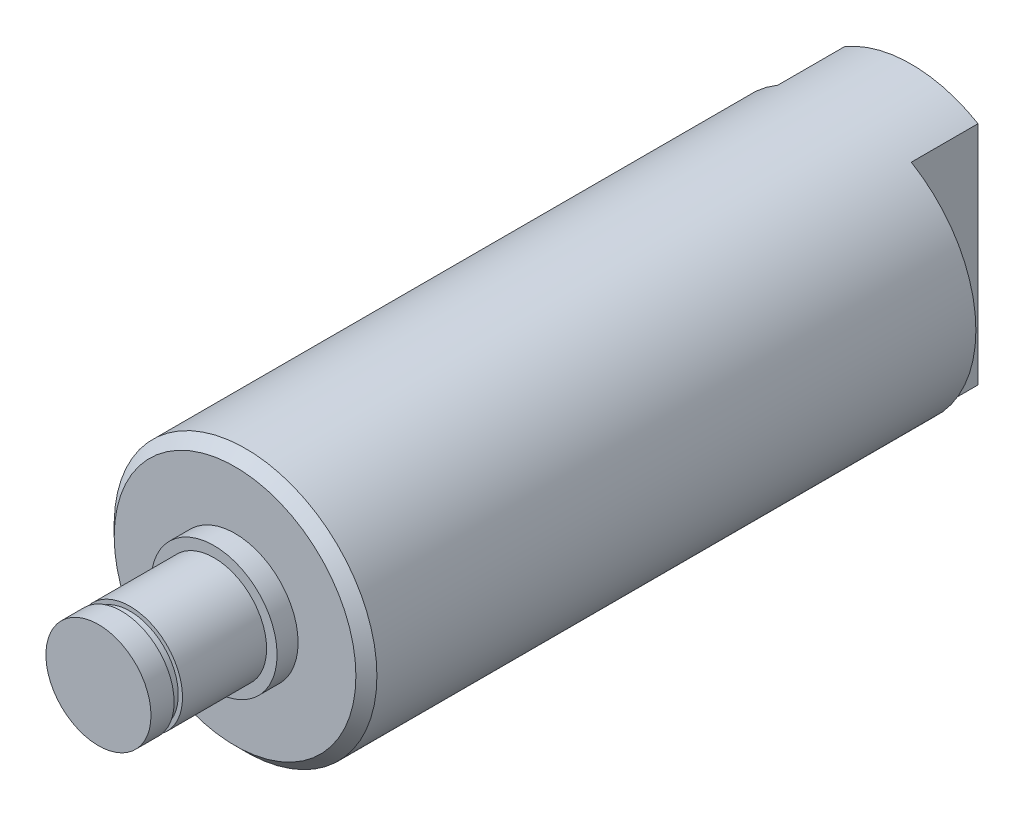
ISO-10303-21;
HEADER;
FILE_DESCRIPTION(('STEP AP214'),'2;1');
FILE_NAME('part.step','',(''),(''),'','','');
FILE_SCHEMA(('AUTOMOTIVE_DESIGN { 1 0 10303 214 1 1 1 1 }'));
ENDSEC;
DATA;
#1=APPLICATION_CONTEXT('core data for automotive mechanical design processes');
#2=APPLICATION_PROTOCOL_DEFINITION('international standard','automotive_design',2000,#1);
#3=PRODUCT_CONTEXT('',#1,'mechanical');
#4=PRODUCT('Part','Part','',(#3));
#5=PRODUCT_RELATED_PRODUCT_CATEGORY('part','',(#4));
#6=PRODUCT_DEFINITION_FORMATION('','',#4);
#7=PRODUCT_DEFINITION_CONTEXT('part definition',#1,'design');
#8=PRODUCT_DEFINITION('design','',#6,#7);
#9=PRODUCT_DEFINITION_SHAPE('','',#8);
#10=(LENGTH_UNIT() NAMED_UNIT(*) SI_UNIT(.MILLI.,.METRE.));
#11=(NAMED_UNIT(*) PLANE_ANGLE_UNIT() SI_UNIT($,.RADIAN.));
#12=(NAMED_UNIT(*) SI_UNIT($,.STERADIAN.) SOLID_ANGLE_UNIT());
#13=UNCERTAINTY_MEASURE_WITH_UNIT(LENGTH_MEASURE(1.E-05),#10,'distance_accuracy_value','');
#14=(GEOMETRIC_REPRESENTATION_CONTEXT(3) GLOBAL_UNCERTAINTY_ASSIGNED_CONTEXT((#13)) GLOBAL_UNIT_ASSIGNED_CONTEXT((#10,
#11,#12)) REPRESENTATION_CONTEXT('',''));
#15=CARTESIAN_POINT('',(0.,0.,0.));
#16=DIRECTION('',(0.,0.,1.));
#17=DIRECTION('',(1.,0.,0.));
#18=AXIS2_PLACEMENT_3D('',#15,#16,#17);
#19=CARTESIAN_POINT('',(0.,0.,77.35));
#20=DIRECTION('',(0.,0.,-1.));
#21=DIRECTION('',(-1.,0.,0.));
#22=AXIS2_PLACEMENT_3D('',#19,#20,#21);
#23=CYLINDRICAL_SURFACE('',#22,5.);
#24=CARTESIAN_POINT('',(0.,0.,74.35));
#25=DIRECTION('',(0.,0.,-1.));
#26=DIRECTION('',(-1.,0.,0.));
#27=AXIS2_PLACEMENT_3D('',#24,#25,#26);
#28=CIRCLE('',#27,5.);
#29=CARTESIAN_POINT('',(-5.,0.,74.35));
#30=VERTEX_POINT('',#29);
#31=EDGE_CURVE('E117',#30,#30,#28,.T.);
#32=ORIENTED_EDGE('',*,*,#31,.T.);
#33=EDGE_LOOP('',(#32));
#34=FACE_BOUND('',#33,.T.);
#35=CARTESIAN_POINT('',(0.,0.,66.35));
#36=DIRECTION('',(0.,0.,1.));
#37=DIRECTION('',(1.,0.,0.));
#38=AXIS2_PLACEMENT_3D('',#35,#36,#37);
#39=CIRCLE('',#38,5.);
#40=CARTESIAN_POINT('',(5.,0.,66.35));
#41=VERTEX_POINT('',#40);
#42=EDGE_CURVE('E126',#41,#41,#39,.T.);
#43=ORIENTED_EDGE('',*,*,#42,.T.);
#44=EDGE_LOOP('',(#43));
#45=FACE_BOUND('',#44,.T.);
#46=ADVANCED_FACE('F38',(#34,#45),#23,.T.);
#47=CARTESIAN_POINT('',(0.,0.,6.35));
#48=DIRECTION('',(0.,0.,1.));
#49=DIRECTION('',(1.,0.,0.));
#50=AXIS2_PLACEMENT_3D('',#47,#48,#49);
#51=PLANE('',#50);
#52=DIRECTION('',(0.,-1.,0.));
#53=VECTOR('',#52,1.);
#54=CARTESIAN_POINT('',(6.35,10.7669633602051,6.35));
#55=LINE('',#54,#53);
#56=CARTESIAN_POINT('',(6.35,10.7669633602051,6.35));
#57=VERTEX_POINT('',#56);
#58=CARTESIAN_POINT('',(6.35,-10.7669633602051,6.35));
#59=VERTEX_POINT('',#58);
#60=EDGE_CURVE('E54',#57,#59,#55,.T.);
#61=ORIENTED_EDGE('',*,*,#60,.F.);
#62=CARTESIAN_POINT('',(0.,0.,6.35));
#63=DIRECTION('',(0.,0.,1.));
#64=DIRECTION('',(1.,0.,0.));
#65=AXIS2_PLACEMENT_3D('',#62,#63,#64);
#66=CIRCLE('',#65,12.5);
#67=EDGE_CURVE('E136',#59,#57,#66,.T.);
#68=ORIENTED_EDGE('',*,*,#67,.F.);
#69=EDGE_LOOP('',(#61,#68));
#70=FACE_BOUND('',#69,.T.);
#71=ADVANCED_FACE('F159',(#70),#51,.F.);
#72=DIRECTION('',(0.,1.,0.));
#73=VECTOR('',#72,1.);
#74=CARTESIAN_POINT('',(-6.34999999999999,10.7669633602051,6.35));
#75=LINE('',#74,#73);
#76=CARTESIAN_POINT('',(-6.34999999999999,-10.7669633602051,6.35));
#77=VERTEX_POINT('',#76);
#78=CARTESIAN_POINT('',(-6.34999999999999,10.7669633602051,6.35));
#79=VERTEX_POINT('',#78);
#80=EDGE_CURVE('E79',#77,#79,#75,.T.);
#81=ORIENTED_EDGE('',*,*,#80,.F.);
#82=EDGE_CURVE('E141',#79,#77,#66,.T.);
#83=ORIENTED_EDGE('',*,*,#82,.F.);
#84=EDGE_LOOP('',(#81,#83));
#85=FACE_BOUND('',#84,.T.);
#86=ADVANCED_FACE('F156',(#85),#51,.F.);
#87=CARTESIAN_POINT('',(0.,0.,66.35));
#88=DIRECTION('',(0.,0.,1.));
#89=DIRECTION('',(1.,0.,0.));
#90=AXIS2_PLACEMENT_3D('',#87,#88,#89);
#91=PLANE('',#90);
#92=CARTESIAN_POINT('',(0.,0.,66.35));
#93=DIRECTION('',(0.,0.,1.));
#94=DIRECTION('',(1.,0.,0.));
#95=AXIS2_PLACEMENT_3D('',#92,#93,#94);
#96=CIRCLE('',#95,6.);
#97=CARTESIAN_POINT('',(6.,0.,66.35));
#98=VERTEX_POINT('',#97);
#99=EDGE_CURVE('E133',#98,#98,#96,.T.);
#100=ORIENTED_EDGE('',*,*,#99,.T.);
#101=EDGE_LOOP('',(#100));
#102=FACE_BOUND('',#101,.T.);
#103=ORIENTED_EDGE('',*,*,#42,.F.);
#104=EDGE_LOOP('',(#103));
#105=FACE_BOUND('',#104,.T.);
#106=ADVANCED_FACE('F158',(#102,#105),#91,.T.);
#107=CARTESIAN_POINT('',(0.,0.,64.35));
#108=DIRECTION('',(0.,0.,1.));
#109=DIRECTION('',(1.,0.,0.));
#110=AXIS2_PLACEMENT_3D('',#107,#108,#109);
#111=PLANE('',#110);
#112=CARTESIAN_POINT('',(0.,0.,64.35));
#113=DIRECTION('',(0.,0.,1.));
#114=DIRECTION('',(1.,0.,0.));
#115=AXIS2_PLACEMENT_3D('',#112,#113,#114);
#116=CIRCLE('',#115,11.5);
#117=CARTESIAN_POINT('',(11.5,0.,64.35));
#118=VERTEX_POINT('',#117);
#119=EDGE_CURVE('E47',#118,#118,#116,.T.);
#120=ORIENTED_EDGE('',*,*,#119,.T.);
#121=EDGE_LOOP('',(#120));
#122=FACE_BOUND('',#121,.T.);
#123=CARTESIAN_POINT('',(0.,0.,64.35));
#124=DIRECTION('',(0.,0.,1.));
#125=DIRECTION('',(1.,0.,0.));
#126=AXIS2_PLACEMENT_3D('',#123,#124,#125);
#127=CIRCLE('',#126,6.);
#128=CARTESIAN_POINT('',(6.,0.,64.35));
#129=VERTEX_POINT('',#128);
#130=EDGE_CURVE('E130',#129,#129,#127,.T.);
#131=ORIENTED_EDGE('',*,*,#130,.F.);
#132=EDGE_LOOP('',(#131));
#133=FACE_BOUND('',#132,.T.);
#134=ADVANCED_FACE('F165',(#122,#133),#111,.T.);
#135=CARTESIAN_POINT('',(0.,0.,64.35));
#136=DIRECTION('',(0.,0.,-1.));
#137=DIRECTION('',(-1.,0.,0.));
#138=AXIS2_PLACEMENT_3D('',#135,#136,#137);
#139=CYLINDRICAL_SURFACE('',#138,12.5);
#140=CARTESIAN_POINT('',(0.,0.,63.35));
#141=DIRECTION('',(0.,0.,1.));
#142=DIRECTION('',(1.,0.,0.));
#143=AXIS2_PLACEMENT_3D('',#140,#141,#142);
#144=CIRCLE('',#143,12.5);
#145=CARTESIAN_POINT('',(12.5,0.,63.35));
#146=VERTEX_POINT('',#145);
#147=EDGE_CURVE('E11',#146,#146,#144,.F.);
#148=ORIENTED_EDGE('',*,*,#147,.T.);
#149=EDGE_LOOP('',(#148));
#150=FACE_BOUND('',#149,.T.);
#151=ORIENTED_EDGE('',*,*,#67,.T.);
#152=DIRECTION('',(0.,0.,1.));
#153=VECTOR('',#152,1.);
#154=CARTESIAN_POINT('',(6.35,10.7669633602051,0.));
#155=LINE('',#154,#153);
#156=CARTESIAN_POINT('',(6.35,10.7669633602051,0.));
#157=VERTEX_POINT('',#156);
#158=EDGE_CURVE('E124',#157,#57,#155,.T.);
#159=ORIENTED_EDGE('',*,*,#158,.F.);
#160=CARTESIAN_POINT('',(0.,0.,0.));
#161=DIRECTION('',(0.,0.,-1.));
#162=DIRECTION('',(-1.,0.,0.));
#163=AXIS2_PLACEMENT_3D('',#160,#161,#162);
#164=CIRCLE('',#163,12.5);
#165=CARTESIAN_POINT('',(-6.34999999999999,10.7669633602051,0.));
#166=VERTEX_POINT('',#165);
#167=EDGE_CURVE('E109',#166,#157,#164,.T.);
#168=ORIENTED_EDGE('',*,*,#167,.F.);
#169=DIRECTION('',(0.,0.,1.));
#170=VECTOR('',#169,1.);
#171=CARTESIAN_POINT('',(-6.34999999999999,10.7669633602051,0.));
#172=LINE('',#171,#170);
#173=EDGE_CURVE('E115',#166,#79,#172,.T.);
#174=ORIENTED_EDGE('',*,*,#173,.T.);
#175=ORIENTED_EDGE('',*,*,#82,.T.);
#176=DIRECTION('',(0.,0.,1.));
#177=VECTOR('',#176,1.);
#178=CARTESIAN_POINT('',(-6.34999999999999,-10.7669633602051,0.));
#179=LINE('',#178,#177);
#180=CARTESIAN_POINT('',(-6.34999999999999,-10.7669633602051,0.));
#181=VERTEX_POINT('',#180);
#182=EDGE_CURVE('E120',#181,#77,#179,.T.);
#183=ORIENTED_EDGE('',*,*,#182,.F.);
#184=CARTESIAN_POINT('',(0.,0.,0.));
#185=DIRECTION('',(0.,0.,-1.));
#186=DIRECTION('',(-1.,0.,0.));
#187=AXIS2_PLACEMENT_3D('',#184,#185,#186);
#188=CIRCLE('',#187,12.5);
#189=CARTESIAN_POINT('',(6.35,-10.7669633602051,0.));
#190=VERTEX_POINT('',#189);
#191=EDGE_CURVE('E112',#190,#181,#188,.T.);
#192=ORIENTED_EDGE('',*,*,#191,.F.);
#193=DIRECTION('',(0.,0.,1.));
#194=VECTOR('',#193,1.);
#195=CARTESIAN_POINT('',(6.35,-10.7669633602051,0.));
#196=LINE('',#195,#194);
#197=EDGE_CURVE('E122',#190,#59,#196,.T.);
#198=ORIENTED_EDGE('',*,*,#197,.T.);
#199=EDGE_LOOP('',(#151,#159,#168,#174,#175,#183,#192,#198));
#200=FACE_BOUND('',#199,.T.);
#201=ADVANCED_FACE('F152',(#150,#200),#139,.T.);
#202=CARTESIAN_POINT('',(0.,0.,66.35));
#203=DIRECTION('',(0.,0.,-1.));
#204=DIRECTION('',(-1.,0.,0.));
#205=AXIS2_PLACEMENT_3D('',#202,#203,#204);
#206=CYLINDRICAL_SURFACE('',#205,6.);
#207=ORIENTED_EDGE('',*,*,#99,.F.);
#208=EDGE_LOOP('',(#207));
#209=FACE_BOUND('',#208,.T.);
#210=ORIENTED_EDGE('',*,*,#130,.T.);
#211=EDGE_LOOP('',(#210));
#212=FACE_BOUND('',#211,.T.);
#213=ADVANCED_FACE('F214',(#209,#212),#206,.T.);
#214=CARTESIAN_POINT('',(6.35,10.7669633602051,0.));
#215=DIRECTION('',(-1.,0.,0.));
#216=DIRECTION('',(0.,0.,1.));
#217=AXIS2_PLACEMENT_3D('',#214,#215,#216);
#218=PLANE('',#217);
#219=ORIENTED_EDGE('',*,*,#60,.T.);
#220=ORIENTED_EDGE('',*,*,#197,.F.);
#221=DIRECTION('',(0.,-1.,0.));
#222=VECTOR('',#221,1.);
#223=CARTESIAN_POINT('',(6.35,10.7669633602051,0.));
#224=LINE('',#223,#222);
#225=EDGE_CURVE('E84',#157,#190,#224,.T.);
#226=ORIENTED_EDGE('',*,*,#225,.F.);
#227=ORIENTED_EDGE('',*,*,#158,.T.);
#228=EDGE_LOOP('',(#219,#220,#226,#227));
#229=FACE_BOUND('',#228,.T.);
#230=ADVANCED_FACE('F212',(#229),#218,.F.);
#231=CARTESIAN_POINT('',(-6.34999999999999,10.7669633602051,0.));
#232=DIRECTION('',(1.,0.,0.));
#233=DIRECTION('',(0.,1.,0.));
#234=AXIS2_PLACEMENT_3D('',#231,#232,#233);
#235=PLANE('',#234);
#236=ORIENTED_EDGE('',*,*,#80,.T.);
#237=ORIENTED_EDGE('',*,*,#173,.F.);
#238=DIRECTION('',(0.,1.,0.));
#239=VECTOR('',#238,1.);
#240=CARTESIAN_POINT('',(-6.34999999999999,10.7669633602051,0.));
#241=LINE('',#240,#239);
#242=EDGE_CURVE('E63',#181,#166,#241,.T.);
#243=ORIENTED_EDGE('',*,*,#242,.F.);
#244=ORIENTED_EDGE('',*,*,#182,.T.);
#245=EDGE_LOOP('',(#236,#237,#243,#244));
#246=FACE_BOUND('',#245,.T.);
#247=ADVANCED_FACE('F209',(#246),#235,.F.);
#248=CARTESIAN_POINT('',(0.,0.,0.));
#249=DIRECTION('',(0.,0.,1.));
#250=DIRECTION('',(1.,0.,0.));
#251=AXIS2_PLACEMENT_3D('',#248,#249,#250);
#252=PLANE('',#251);
#253=CARTESIAN_POINT('',(0.,0.,0.));
#254=DIRECTION('',(0.,0.,-1.));
#255=DIRECTION('',(-1.,0.,0.));
#256=AXIS2_PLACEMENT_3D('',#253,#254,#255);
#257=CIRCLE('',#256,4.4);
#258=CARTESIAN_POINT('',(-4.4,0.,0.));
#259=VERTEX_POINT('',#258);
#260=EDGE_CURVE('E98',#259,#259,#257,.T.);
#261=ORIENTED_EDGE('',*,*,#260,.F.);
#262=EDGE_LOOP('',(#261));
#263=FACE_BOUND('',#262,.T.);
#264=ORIENTED_EDGE('',*,*,#191,.T.);
#265=ORIENTED_EDGE('',*,*,#242,.T.);
#266=ORIENTED_EDGE('',*,*,#167,.T.);
#267=ORIENTED_EDGE('',*,*,#225,.T.);
#268=EDGE_LOOP('',(#264,#265,#266,#267));
#269=FACE_BOUND('',#268,.T.);
#270=ADVANCED_FACE('F204',(#263,#269),#252,.F.);
#271=CARTESIAN_POINT('',(0.,5.4,74.35));
#272=DIRECTION('',(0.,0.,-1.));
#273=DIRECTION('',(-1.,0.,0.));
#274=AXIS2_PLACEMENT_3D('',#271,#272,#273);
#275=PLANE('',#274);
#276=CARTESIAN_POINT('',(0.,0.,74.35));
#277=DIRECTION('',(0.,0.,-1.));
#278=DIRECTION('',(-1.,0.,0.));
#279=AXIS2_PLACEMENT_3D('',#276,#277,#278);
#280=CIRCLE('',#279,4.6);
#281=CARTESIAN_POINT('',(-4.6,0.,74.35));
#282=VERTEX_POINT('',#281);
#283=EDGE_CURVE('E97',#282,#282,#280,.T.);
#284=ORIENTED_EDGE('',*,*,#283,.T.);
#285=EDGE_LOOP('',(#284));
#286=FACE_BOUND('',#285,.T.);
#287=ORIENTED_EDGE('',*,*,#31,.F.);
#288=EDGE_LOOP('',(#287));
#289=FACE_BOUND('',#288,.T.);
#290=ADVANCED_FACE('F195',(#286,#289),#275,.F.);
#291=CARTESIAN_POINT('',(0.,5.4,75.15));
#292=DIRECTION('',(0.,0.,1.));
#293=DIRECTION('',(1.,0.,0.));
#294=AXIS2_PLACEMENT_3D('',#291,#292,#293);
#295=PLANE('',#294);
#296=CARTESIAN_POINT('',(0.,0.,75.15));
#297=DIRECTION('',(0.,0.,-1.));
#298=DIRECTION('',(-1.,0.,0.));
#299=AXIS2_PLACEMENT_3D('',#296,#297,#298);
#300=CIRCLE('',#299,4.6);
#301=CARTESIAN_POINT('',(-4.6,0.,75.15));
#302=VERTEX_POINT('',#301);
#303=EDGE_CURVE('E101',#302,#302,#300,.T.);
#304=ORIENTED_EDGE('',*,*,#303,.F.);
#305=EDGE_LOOP('',(#304));
#306=FACE_BOUND('',#305,.T.);
#307=CARTESIAN_POINT('',(0.,0.,75.15));
#308=DIRECTION('',(0.,0.,1.));
#309=DIRECTION('',(1.,0.,0.));
#310=AXIS2_PLACEMENT_3D('',#307,#308,#309);
#311=CIRCLE('',#310,5.);
#312=CARTESIAN_POINT('',(5.,0.,75.15));
#313=VERTEX_POINT('',#312);
#314=EDGE_CURVE('E108',#313,#313,#311,.T.);
#315=ORIENTED_EDGE('',*,*,#314,.F.);
#316=EDGE_LOOP('',(#315));
#317=FACE_BOUND('',#316,.T.);
#318=ADVANCED_FACE('F193',(#306,#317),#295,.F.);
#319=CARTESIAN_POINT('',(0.,0.,66.35));
#320=DIRECTION('',(0.,0.,-1.));
#321=DIRECTION('',(-1.,0.,0.));
#322=AXIS2_PLACEMENT_3D('',#319,#320,#321);
#323=CYLINDRICAL_SURFACE('',#322,4.6);
#324=ORIENTED_EDGE('',*,*,#283,.F.);
#325=EDGE_LOOP('',(#324));
#326=FACE_BOUND('',#325,.T.);
#327=ORIENTED_EDGE('',*,*,#303,.T.);
#328=EDGE_LOOP('',(#327));
#329=FACE_BOUND('',#328,.T.);
#330=ADVANCED_FACE('F187',(#326,#329),#323,.T.);
#331=CARTESIAN_POINT('',(0.,0.,77.35));
#332=DIRECTION('',(0.,0.,1.));
#333=DIRECTION('',(1.,0.,0.));
#334=AXIS2_PLACEMENT_3D('',#331,#332,#333);
#335=PLANE('',#334);
#336=CARTESIAN_POINT('',(0.,0.,77.35));
#337=DIRECTION('',(0.,0.,1.));
#338=DIRECTION('',(1.,0.,0.));
#339=AXIS2_PLACEMENT_3D('',#336,#337,#338);
#340=CIRCLE('',#339,5.);
#341=CARTESIAN_POINT('',(5.,0.,77.35));
#342=VERTEX_POINT('',#341);
#343=EDGE_CURVE('E127',#342,#342,#340,.T.);
#344=ORIENTED_EDGE('',*,*,#343,.T.);
#345=EDGE_LOOP('',(#344));
#346=FACE_BOUND('',#345,.T.);
#347=ADVANCED_FACE('F180',(#346),#335,.T.);
#348=ORIENTED_EDGE('',*,*,#314,.T.);
#349=EDGE_LOOP('',(#348));
#350=FACE_BOUND('',#349,.T.);
#351=ORIENTED_EDGE('',*,*,#343,.F.);
#352=EDGE_LOOP('',(#351));
#353=FACE_BOUND('',#352,.T.);
#354=ADVANCED_FACE('F174',(#350,#353),#23,.T.);
#355=CARTESIAN_POINT('',(0.,0.,64.35));
#356=DIRECTION('',(0.,0.,-1.));
#357=DIRECTION('',(-1.,0.,0.));
#358=AXIS2_PLACEMENT_3D('',#355,#356,#357);
#359=CONICAL_SURFACE('',#358,11.5,0.785398163397445);
#360=ORIENTED_EDGE('',*,*,#147,.F.);
#361=EDGE_LOOP('',(#360));
#362=FACE_BOUND('',#361,.T.);
#363=ORIENTED_EDGE('',*,*,#119,.F.);
#364=EDGE_LOOP('',(#363));
#365=FACE_BOUND('',#364,.T.);
#366=ADVANCED_FACE('F41',(#362,#365),#359,.T.);
#367=CARTESIAN_POINT('',(0.,0.,25.));
#368=DIRECTION('',(0.,0.,-1.));
#369=DIRECTION('',(-1.,0.,0.));
#370=AXIS2_PLACEMENT_3D('',#367,#368,#369);
#371=CONICAL_SURFACE('',#370,4.39999999999999,1.02974425867665);
#372=CARTESIAN_POINT('',(0.,0.,27.6437867237213));
#373=VERTEX_POINT('',#372);
#374=VERTEX_LOOP('',#373);
#375=FACE_BOUND('',#374,.T.);
#376=CARTESIAN_POINT('',(0.,0.,25.));
#377=DIRECTION('',(0.,0.,-1.));
#378=DIRECTION('',(-1.,0.,0.));
#379=AXIS2_PLACEMENT_3D('',#376,#377,#378);
#380=CIRCLE('',#379,4.39999999999999);
#381=CARTESIAN_POINT('',(-4.39999999999999,0.,25.));
#382=VERTEX_POINT('',#381);
#383=EDGE_CURVE('E95',#382,#382,#380,.T.);
#384=ORIENTED_EDGE('',*,*,#383,.T.);
#385=EDGE_LOOP('',(#384));
#386=FACE_BOUND('',#385,.T.);
#387=ADVANCED_FACE('F88',(#375,#386),#371,.F.);
#388=CARTESIAN_POINT('',(0.,0.,0.));
#389=DIRECTION('',(0.,0.,-1.));
#390=DIRECTION('',(-1.,0.,0.));
#391=AXIS2_PLACEMENT_3D('',#388,#389,#390);
#392=CYLINDRICAL_SURFACE('',#391,4.4);
#393=ORIENTED_EDGE('',*,*,#383,.F.);
#394=EDGE_LOOP('',(#393));
#395=FACE_BOUND('',#394,.T.);
#396=ORIENTED_EDGE('',*,*,#260,.T.);
#397=EDGE_LOOP('',(#396));
#398=FACE_BOUND('',#397,.T.);
#399=ADVANCED_FACE('F91',(#395,#398),#392,.F.);
#400=CLOSED_SHELL('',(#46,#71,#86,#106,#134,#201,#213,#230,#247,#270,#290,#318,#330,#347,#354,
#366,#387,#399));
#401=MANIFOLD_SOLID_BREP('B2',#400);
#402=ADVANCED_BREP_SHAPE_REPRESENTATION('',(#18,#401),#14);
#403=SHAPE_DEFINITION_REPRESENTATION(#9,#402);
ENDSEC;
END-ISO-10303-21;
